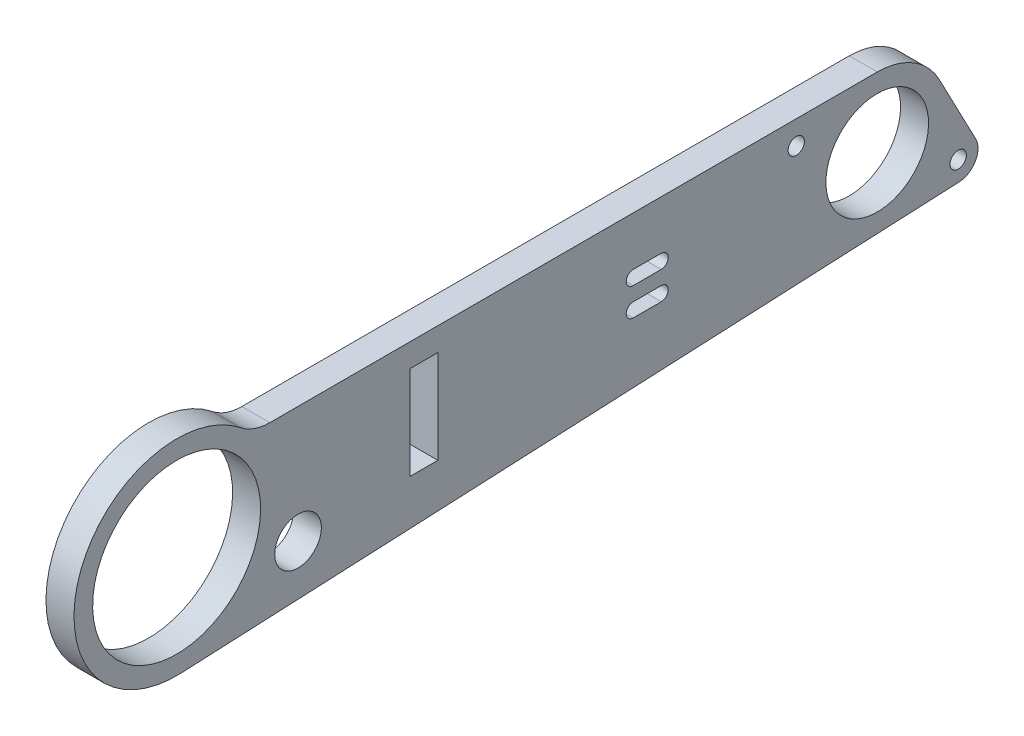
ISO-10303-21;
HEADER;
FILE_DESCRIPTION(('STEP AP214'),'2;1');
FILE_NAME('part.step','',(''),(''),'','','');
FILE_SCHEMA(('AUTOMOTIVE_DESIGN { 1 0 10303 214 1 1 1 1 }'));
ENDSEC;
DATA;
#1=APPLICATION_CONTEXT('core data for automotive mechanical design processes');
#2=APPLICATION_PROTOCOL_DEFINITION('international standard','automotive_design',2000,#1);
#3=PRODUCT_CONTEXT('',#1,'mechanical');
#4=PRODUCT('Part','Part','',(#3));
#5=PRODUCT_RELATED_PRODUCT_CATEGORY('part','',(#4));
#6=PRODUCT_DEFINITION_FORMATION('','',#4);
#7=PRODUCT_DEFINITION_CONTEXT('part definition',#1,'design');
#8=PRODUCT_DEFINITION('design','',#6,#7);
#9=PRODUCT_DEFINITION_SHAPE('','',#8);
#10=(LENGTH_UNIT() NAMED_UNIT(*) SI_UNIT(.MILLI.,.METRE.));
#11=(NAMED_UNIT(*) PLANE_ANGLE_UNIT() SI_UNIT($,.RADIAN.));
#12=(NAMED_UNIT(*) SI_UNIT($,.STERADIAN.) SOLID_ANGLE_UNIT());
#13=UNCERTAINTY_MEASURE_WITH_UNIT(LENGTH_MEASURE(1.E-05),#10,'distance_accuracy_value','');
#14=(GEOMETRIC_REPRESENTATION_CONTEXT(3) GLOBAL_UNCERTAINTY_ASSIGNED_CONTEXT((#13)) GLOBAL_UNIT_ASSIGNED_CONTEXT((#10,
#11,#12)) REPRESENTATION_CONTEXT('',''));
#15=CARTESIAN_POINT('',(0.,0.,0.));
#16=DIRECTION('',(0.,0.,1.));
#17=DIRECTION('',(1.,0.,0.));
#18=AXIS2_PLACEMENT_3D('',#15,#16,#17);
#19=CARTESIAN_POINT('',(-6.,0.,-71.58162225));
#20=DIRECTION('',(1.,0.,0.));
#21=DIRECTION('',(0.,1.,0.));
#22=AXIS2_PLACEMENT_3D('',#19,#20,#21);
#23=PLANE('',#22);
#24=CARTESIAN_POINT('',(-6.,0.,-150.1632445));
#25=DIRECTION('',(1.,0.,0.));
#26=DIRECTION('',(0.,-1.,0.));
#27=AXIS2_PLACEMENT_3D('',#24,#25,#26);
#28=CIRCLE('',#27,11.);
#29=CARTESIAN_POINT('',(-6.,11.,-150.1632445));
#30=VERTEX_POINT('',#29);
#31=EDGE_CURVE('E413',#30,#30,#28,.T.);
#32=ORIENTED_EDGE('',*,*,#31,.T.);
#33=EDGE_LOOP('',(#32));
#34=FACE_BOUND('',#33,.T.);
#35=CARTESIAN_POINT('',(-6.,0.,0.));
#36=DIRECTION('',(1.,0.,0.));
#37=DIRECTION('',(0.,-1.,0.));
#38=AXIS2_PLACEMENT_3D('',#35,#36,#37);
#39=CIRCLE('',#38,18.);
#40=CARTESIAN_POINT('',(-6.,18.,0.));
#41=VERTEX_POINT('',#40);
#42=EDGE_CURVE('E311',#41,#41,#39,.T.);
#43=ORIENTED_EDGE('',*,*,#42,.T.);
#44=EDGE_LOOP('',(#43));
#45=FACE_BOUND('',#44,.T.);
#46=CARTESIAN_POINT('',(-6.,-10.,-26.025550563407));
#47=DIRECTION('',(1.,0.,0.));
#48=DIRECTION('',(0.,0.,-1.));
#49=AXIS2_PLACEMENT_3D('',#46,#47,#48);
#50=CIRCLE('',#49,5.);
#51=CARTESIAN_POINT('',(-6.,-10.,-21.025550563407));
#52=VERTEX_POINT('',#51);
#53=EDGE_CURVE('E264',#52,#52,#50,.T.);
#54=ORIENTED_EDGE('',*,*,#53,.T.);
#55=EDGE_LOOP('',(#54));
#56=FACE_BOUND('',#55,.T.);
#57=CARTESIAN_POINT('',(-6.,-3.,-97.8624835205048));
#58=DIRECTION('',(1.,0.,0.));
#59=DIRECTION('',(0.,1.,0.));
#60=AXIS2_PLACEMENT_3D('',#57,#58,#59);
#61=CIRCLE('',#60,1.5);
#62=CARTESIAN_POINT('',(-6.,-1.5,-97.8624835205048));
#63=VERTEX_POINT('',#62);
#64=CARTESIAN_POINT('',(-6.,-4.5,-97.8624835205048));
#65=VERTEX_POINT('',#64);
#66=EDGE_CURVE('E302',#63,#65,#61,.T.);
#67=ORIENTED_EDGE('',*,*,#66,.T.);
#68=DIRECTION('',(0.,0.,-1.));
#69=VECTOR('',#68,1.);
#70=CARTESIAN_POINT('',(-6.,-4.5,-87.7220528852524));
#71=LINE('',#70,#69);
#72=CARTESIAN_POINT('',(-6.,-4.5,-103.862483520505));
#73=VERTEX_POINT('',#72);
#74=EDGE_CURVE('E437',#65,#73,#71,.T.);
#75=ORIENTED_EDGE('',*,*,#74,.T.);
#76=CARTESIAN_POINT('',(-6.,-3.,-103.862483520505));
#77=DIRECTION('',(1.,0.,0.));
#78=DIRECTION('',(0.,-1.,0.));
#79=AXIS2_PLACEMENT_3D('',#76,#77,#78);
#80=CIRCLE('',#79,1.5);
#81=CARTESIAN_POINT('',(-6.,-1.5,-103.862483520505));
#82=VERTEX_POINT('',#81);
#83=EDGE_CURVE('E346',#73,#82,#80,.T.);
#84=ORIENTED_EDGE('',*,*,#83,.T.);
#85=DIRECTION('',(0.,0.,1.));
#86=VECTOR('',#85,1.);
#87=CARTESIAN_POINT('',(-6.,-1.5,-84.7220528852524));
#88=LINE('',#87,#86);
#89=EDGE_CURVE('E352',#82,#63,#88,.T.);
#90=ORIENTED_EDGE('',*,*,#89,.T.);
#91=EDGE_LOOP('',(#67,#75,#84,#90));
#92=FACE_BOUND('',#91,.T.);
#93=DIRECTION('',(0.,0.,1.));
#94=VECTOR('',#93,1.);
#95=CARTESIAN_POINT('',(-6.,10.,-60.790811125));
#96=LINE('',#95,#94);
#97=CARTESIAN_POINT('',(-6.,10.,-56.));
#98=VERTEX_POINT('',#97);
#99=CARTESIAN_POINT('',(-6.,10.,-50.));
#100=VERTEX_POINT('',#99);
#101=EDGE_CURVE('E321',#98,#100,#96,.T.);
#102=ORIENTED_EDGE('',*,*,#101,.T.);
#103=DIRECTION('',(0.,-1.,0.));
#104=VECTOR('',#103,1.);
#105=CARTESIAN_POINT('',(-6.,-5.,-50.));
#106=LINE('',#105,#104);
#107=CARTESIAN_POINT('',(-6.,-10.,-50.));
#108=VERTEX_POINT('',#107);
#109=EDGE_CURVE('E325',#100,#108,#106,.T.);
#110=ORIENTED_EDGE('',*,*,#109,.T.);
#111=DIRECTION('',(0.,0.,-1.));
#112=VECTOR('',#111,1.);
#113=CARTESIAN_POINT('',(-6.,-10.,-63.790811125));
#114=LINE('',#113,#112);
#115=CARTESIAN_POINT('',(-6.,-10.,-56.));
#116=VERTEX_POINT('',#115);
#117=EDGE_CURVE('E285',#108,#116,#114,.T.);
#118=ORIENTED_EDGE('',*,*,#117,.T.);
#119=DIRECTION('',(0.,1.,0.));
#120=VECTOR('',#119,1.);
#121=CARTESIAN_POINT('',(-6.,5.,-56.));
#122=LINE('',#121,#120);
#123=EDGE_CURVE('E280',#116,#98,#122,.T.);
#124=ORIENTED_EDGE('',*,*,#123,.T.);
#125=EDGE_LOOP('',(#102,#110,#118,#124));
#126=FACE_BOUND('',#125,.T.);
#127=CARTESIAN_POINT('',(-6.,3.,-103.862483520505));
#128=DIRECTION('',(1.,0.,0.));
#129=DIRECTION('',(0.,-1.,0.));
#130=AXIS2_PLACEMENT_3D('',#127,#128,#129);
#131=CIRCLE('',#130,1.5);
#132=CARTESIAN_POINT('',(-6.,1.5,-103.862483520505));
#133=VERTEX_POINT('',#132);
#134=CARTESIAN_POINT('',(-6.,4.5,-103.862483520505));
#135=VERTEX_POINT('',#134);
#136=EDGE_CURVE('E330',#133,#135,#131,.T.);
#137=ORIENTED_EDGE('',*,*,#136,.T.);
#138=DIRECTION('',(0.,0.,1.));
#139=VECTOR('',#138,1.);
#140=CARTESIAN_POINT('',(-6.,4.5,-84.7220528852524));
#141=LINE('',#140,#139);
#142=CARTESIAN_POINT('',(-6.,4.5,-97.8624835205048));
#143=VERTEX_POINT('',#142);
#144=EDGE_CURVE('E172',#135,#143,#141,.T.);
#145=ORIENTED_EDGE('',*,*,#144,.T.);
#146=CARTESIAN_POINT('',(-6.,3.,-97.8624835205048));
#147=DIRECTION('',(1.,0.,0.));
#148=DIRECTION('',(0.,1.,0.));
#149=AXIS2_PLACEMENT_3D('',#146,#147,#148);
#150=CIRCLE('',#149,1.5);
#151=CARTESIAN_POINT('',(-6.,1.5,-97.8624835205048));
#152=VERTEX_POINT('',#151);
#153=EDGE_CURVE('E294',#143,#152,#150,.T.);
#154=ORIENTED_EDGE('',*,*,#153,.T.);
#155=DIRECTION('',(0.,0.,-1.));
#156=VECTOR('',#155,1.);
#157=CARTESIAN_POINT('',(-6.,1.5,-87.7220528852524));
#158=LINE('',#157,#156);
#159=EDGE_CURVE('E373',#152,#133,#158,.T.);
#160=ORIENTED_EDGE('',*,*,#159,.T.);
#161=EDGE_LOOP('',(#137,#145,#154,#160));
#162=FACE_BOUND('',#161,.T.);
#163=CARTESIAN_POINT('',(-6.,-9.95212297192439,-167.511306303893));
#164=DIRECTION('',(1.,0.,0.));
#165=DIRECTION('',(0.,0.,1.));
#166=AXIS2_PLACEMENT_3D('',#163,#164,#165);
#167=CIRCLE('',#166,1.75);
#168=CARTESIAN_POINT('',(-6.,-9.95212297192439,-169.261306303893));
#169=VERTEX_POINT('',#168);
#170=EDGE_CURVE('E363',#169,#169,#167,.T.);
#171=ORIENTED_EDGE('',*,*,#170,.T.);
#172=EDGE_LOOP('',(#171));
#173=FACE_BOUND('',#172,.T.);
#174=CARTESIAN_POINT('',(-6.,9.9521229719244,-132.815182696107));
#175=DIRECTION('',(1.,0.,0.));
#176=DIRECTION('',(0.,0.,-1.));
#177=AXIS2_PLACEMENT_3D('',#174,#175,#176);
#178=CIRCLE('',#177,1.75);
#179=CARTESIAN_POINT('',(-6.,9.9521229719244,-131.065182696107));
#180=VERTEX_POINT('',#179);
#181=EDGE_CURVE('E339',#180,#180,#178,.T.);
#182=ORIENTED_EDGE('',*,*,#181,.T.);
#183=EDGE_LOOP('',(#182));
#184=FACE_BOUND('',#183,.T.);
#185=CARTESIAN_POINT('',(-6.,0.,-150.1632445));
#186=DIRECTION('',(-1.,0.,0.));
#187=DIRECTION('',(0.,1.,0.));
#188=AXIS2_PLACEMENT_3D('',#185,#186,#187);
#189=CIRCLE('',#188,15.);
#190=CARTESIAN_POINT('',(-6.,15.,-150.1632445));
#191=VERTEX_POINT('',#190);
#192=CARTESIAN_POINT('',(-6.,6.95979415000631,-163.450880308884));
#193=VERTEX_POINT('',#192);
#194=EDGE_CURVE('E27',#191,#193,#189,.T.);
#195=ORIENTED_EDGE('',*,*,#194,.T.);
#196=DIRECTION('',(0.,-0.885842387258936,-0.46398627666709));
#197=VECTOR('',#196,1.);
#198=CARTESIAN_POINT('',(-6.,-7.98018129608929,-171.276136449743));
#199=LINE('',#198,#197);
#200=CARTESIAN_POINT('',(-6.,-7.98018129608929,-171.276136449743));
#201=VERTEX_POINT('',#200);
#202=EDGE_CURVE('E295',#193,#201,#199,.T.);
#203=ORIENTED_EDGE('',*,*,#202,.T.);
#204=CARTESIAN_POINT('',(-6.,-9.95212297192439,-167.511306303893));
#205=DIRECTION('',(-1.,0.,0.));
#206=DIRECTION('',(0.,0.,-1.));
#207=AXIS2_PLACEMENT_3D('',#204,#205,#206);
#208=CIRCLE('',#207,4.25);
#209=CARTESIAN_POINT('',(-6.,-14.1975027391585,-167.709424026369));
#210=VERTEX_POINT('',#209);
#211=EDGE_CURVE('E372',#201,#210,#208,.T.);
#212=ORIENTED_EDGE('',*,*,#211,.T.);
#213=DIRECTION('',(0.,-0.046615934700319,0.998912886408027));
#214=VECTOR('',#213,1.);
#215=CARTESIAN_POINT('',(-6.,-14.9836932961204,-150.862483520505));
#216=LINE('',#215,#214);
#217=CARTESIAN_POINT('',(-6.,-21.9760835009766,-1.02555056340702));
#218=VERTEX_POINT('',#217);
#219=EDGE_CURVE('E384',#210,#218,#216,.T.);
#220=ORIENTED_EDGE('',*,*,#219,.T.);
#221=CARTESIAN_POINT('',(-6.,0.,0.));
#222=DIRECTION('',(-1.,0.,0.));
#223=DIRECTION('',(0.,1.,0.));
#224=AXIS2_PLACEMENT_3D('',#221,#222,#223);
#225=CIRCLE('',#224,22.);
#226=CARTESIAN_POINT('',(-6.,17.1875,-13.7328017443637));
#227=VERTEX_POINT('',#226);
#228=EDGE_CURVE('E389',#218,#227,#225,.T.);
#229=ORIENTED_EDGE('',*,*,#228,.T.);
#230=CARTESIAN_POINT('',(-6.,25.,-19.9749843554382));
#231=DIRECTION('',(-1.,0.,0.));
#232=DIRECTION('',(0.,-0.943729304408844,0.330718913883074));
#233=AXIS2_PLACEMENT_3D('',#230,#231,#232);
#234=CIRCLE('',#233,10.);
#235=CARTESIAN_POINT('',(-6.,15.,-19.9749843554382));
#236=VERTEX_POINT('',#235);
#237=EDGE_CURVE('E255',#236,#227,#234,.T.);
#238=ORIENTED_EDGE('',*,*,#237,.F.);
#239=DIRECTION('',(0.,0.,-1.));
#240=VECTOR('',#239,1.);
#241=CARTESIAN_POINT('',(-6.,15.,-150.1632445));
#242=LINE('',#241,#240);
#243=EDGE_CURVE('E443',#236,#191,#242,.T.);
#244=ORIENTED_EDGE('',*,*,#243,.T.);
#245=EDGE_LOOP('',(#195,#203,#212,#220,#229,#238,#244));
#246=FACE_BOUND('',#245,.T.);
#247=ADVANCED_FACE('F16',(#34,#45,#56,#92,#126,#162,#173,#184,#246),#23,.F.);
#248=CARTESIAN_POINT('',(0.,0.,-71.58162225));
#249=DIRECTION('',(1.,0.,0.));
#250=DIRECTION('',(0.,1.,0.));
#251=AXIS2_PLACEMENT_3D('',#248,#249,#250);
#252=PLANE('',#251);
#253=CARTESIAN_POINT('',(0.,0.,-150.1632445));
#254=DIRECTION('',(-1.,0.,0.));
#255=DIRECTION('',(0.,-1.,0.));
#256=AXIS2_PLACEMENT_3D('',#253,#254,#255);
#257=CIRCLE('',#256,11.);
#258=CARTESIAN_POINT('',(0.,11.,-150.1632445));
#259=VERTEX_POINT('',#258);
#260=EDGE_CURVE('E308',#259,#259,#257,.T.);
#261=ORIENTED_EDGE('',*,*,#260,.T.);
#262=EDGE_LOOP('',(#261));
#263=FACE_BOUND('',#262,.T.);
#264=CARTESIAN_POINT('',(0.,0.,0.));
#265=DIRECTION('',(-1.,0.,0.));
#266=DIRECTION('',(0.,-1.,0.));
#267=AXIS2_PLACEMENT_3D('',#264,#265,#266);
#268=CIRCLE('',#267,18.);
#269=CARTESIAN_POINT('',(0.,18.,0.));
#270=VERTEX_POINT('',#269);
#271=EDGE_CURVE('E459',#270,#270,#268,.T.);
#272=ORIENTED_EDGE('',*,*,#271,.T.);
#273=EDGE_LOOP('',(#272));
#274=FACE_BOUND('',#273,.T.);
#275=CARTESIAN_POINT('',(0.,-10.,-26.025550563407));
#276=DIRECTION('',(-1.,0.,0.));
#277=DIRECTION('',(0.,0.,-1.));
#278=AXIS2_PLACEMENT_3D('',#275,#276,#277);
#279=CIRCLE('',#278,5.);
#280=CARTESIAN_POINT('',(0.,-10.,-21.025550563407));
#281=VERTEX_POINT('',#280);
#282=EDGE_CURVE('E364',#281,#281,#279,.T.);
#283=ORIENTED_EDGE('',*,*,#282,.T.);
#284=EDGE_LOOP('',(#283));
#285=FACE_BOUND('',#284,.T.);
#286=CARTESIAN_POINT('',(0.,-3.,-97.8624835205048));
#287=DIRECTION('',(-1.,0.,0.));
#288=DIRECTION('',(0.,1.,0.));
#289=AXIS2_PLACEMENT_3D('',#286,#287,#288);
#290=CIRCLE('',#289,1.5);
#291=CARTESIAN_POINT('',(0.,-4.5,-97.8624835205048));
#292=VERTEX_POINT('',#291);
#293=CARTESIAN_POINT('',(0.,-1.5,-97.8624835205048));
#294=VERTEX_POINT('',#293);
#295=EDGE_CURVE('E299',#292,#294,#290,.T.);
#296=ORIENTED_EDGE('',*,*,#295,.T.);
#297=DIRECTION('',(0.,0.,-1.));
#298=VECTOR('',#297,1.);
#299=CARTESIAN_POINT('',(0.,-1.5,-84.7220528852524));
#300=LINE('',#299,#298);
#301=CARTESIAN_POINT('',(0.,-1.5,-103.862483520505));
#302=VERTEX_POINT('',#301);
#303=EDGE_CURVE('E356',#294,#302,#300,.T.);
#304=ORIENTED_EDGE('',*,*,#303,.T.);
#305=CARTESIAN_POINT('',(0.,-3.,-103.862483520505));
#306=DIRECTION('',(-1.,0.,0.));
#307=DIRECTION('',(0.,-1.,0.));
#308=AXIS2_PLACEMENT_3D('',#305,#306,#307);
#309=CIRCLE('',#308,1.5);
#310=CARTESIAN_POINT('',(0.,-4.5,-103.862483520505));
#311=VERTEX_POINT('',#310);
#312=EDGE_CURVE('E345',#302,#311,#309,.T.);
#313=ORIENTED_EDGE('',*,*,#312,.T.);
#314=DIRECTION('',(0.,0.,1.));
#315=VECTOR('',#314,1.);
#316=CARTESIAN_POINT('',(0.,-4.5,-87.7220528852524));
#317=LINE('',#316,#315);
#318=EDGE_CURVE('E368',#311,#292,#317,.T.);
#319=ORIENTED_EDGE('',*,*,#318,.T.);
#320=EDGE_LOOP('',(#296,#304,#313,#319));
#321=FACE_BOUND('',#320,.T.);
#322=DIRECTION('',(0.,0.,-1.));
#323=VECTOR('',#322,1.);
#324=CARTESIAN_POINT('',(0.,10.,-60.790811125));
#325=LINE('',#324,#323);
#326=CARTESIAN_POINT('',(0.,10.,-50.));
#327=VERTEX_POINT('',#326);
#328=CARTESIAN_POINT('',(0.,10.,-56.));
#329=VERTEX_POINT('',#328);
#330=EDGE_CURVE('E317',#327,#329,#325,.T.);
#331=ORIENTED_EDGE('',*,*,#330,.T.);
#332=DIRECTION('',(0.,-1.,0.));
#333=VECTOR('',#332,1.);
#334=CARTESIAN_POINT('',(0.,5.,-56.));
#335=LINE('',#334,#333);
#336=CARTESIAN_POINT('',(0.,-10.,-56.));
#337=VERTEX_POINT('',#336);
#338=EDGE_CURVE('E20',#329,#337,#335,.T.);
#339=ORIENTED_EDGE('',*,*,#338,.T.);
#340=DIRECTION('',(0.,0.,1.));
#341=VECTOR('',#340,1.);
#342=CARTESIAN_POINT('',(0.,-10.,-63.790811125));
#343=LINE('',#342,#341);
#344=CARTESIAN_POINT('',(0.,-10.,-50.));
#345=VERTEX_POINT('',#344);
#346=EDGE_CURVE('E392',#337,#345,#343,.T.);
#347=ORIENTED_EDGE('',*,*,#346,.T.);
#348=DIRECTION('',(0.,1.,0.));
#349=VECTOR('',#348,1.);
#350=CARTESIAN_POINT('',(0.,-5.,-50.));
#351=LINE('',#350,#349);
#352=EDGE_CURVE('E431',#345,#327,#351,.T.);
#353=ORIENTED_EDGE('',*,*,#352,.T.);
#354=EDGE_LOOP('',(#331,#339,#347,#353));
#355=FACE_BOUND('',#354,.T.);
#356=CARTESIAN_POINT('',(0.,3.,-103.862483520505));
#357=DIRECTION('',(-1.,0.,0.));
#358=DIRECTION('',(0.,-1.,0.));
#359=AXIS2_PLACEMENT_3D('',#356,#357,#358);
#360=CIRCLE('',#359,1.5);
#361=CARTESIAN_POINT('',(0.,4.5,-103.862483520505));
#362=VERTEX_POINT('',#361);
#363=CARTESIAN_POINT('',(0.,1.5,-103.862483520505));
#364=VERTEX_POINT('',#363);
#365=EDGE_CURVE('E298',#362,#364,#360,.T.);
#366=ORIENTED_EDGE('',*,*,#365,.T.);
#367=DIRECTION('',(0.,0.,1.));
#368=VECTOR('',#367,1.);
#369=CARTESIAN_POINT('',(0.,1.5,-87.7220528852524));
#370=LINE('',#369,#368);
#371=CARTESIAN_POINT('',(0.,1.5,-97.8624835205048));
#372=VERTEX_POINT('',#371);
#373=EDGE_CURVE('E276',#364,#372,#370,.T.);
#374=ORIENTED_EDGE('',*,*,#373,.T.);
#375=CARTESIAN_POINT('',(0.,3.,-97.8624835205048));
#376=DIRECTION('',(-1.,0.,0.));
#377=DIRECTION('',(0.,1.,0.));
#378=AXIS2_PLACEMENT_3D('',#375,#376,#377);
#379=CIRCLE('',#378,1.5);
#380=CARTESIAN_POINT('',(0.,4.5,-97.8624835205048));
#381=VERTEX_POINT('',#380);
#382=EDGE_CURVE('E313',#372,#381,#379,.T.);
#383=ORIENTED_EDGE('',*,*,#382,.T.);
#384=DIRECTION('',(0.,0.,-1.));
#385=VECTOR('',#384,1.);
#386=CARTESIAN_POINT('',(0.,4.5,-84.7220528852524));
#387=LINE('',#386,#385);
#388=EDGE_CURVE('E157',#381,#362,#387,.T.);
#389=ORIENTED_EDGE('',*,*,#388,.T.);
#390=EDGE_LOOP('',(#366,#374,#383,#389));
#391=FACE_BOUND('',#390,.T.);
#392=CARTESIAN_POINT('',(0.,-9.95212297192439,-167.511306303893));
#393=DIRECTION('',(-1.,0.,0.));
#394=DIRECTION('',(0.,0.,1.));
#395=AXIS2_PLACEMENT_3D('',#392,#393,#394);
#396=CIRCLE('',#395,1.75);
#397=CARTESIAN_POINT('',(0.,-9.95212297192439,-169.261306303893));
#398=VERTEX_POINT('',#397);
#399=EDGE_CURVE('E198',#398,#398,#396,.T.);
#400=ORIENTED_EDGE('',*,*,#399,.T.);
#401=EDGE_LOOP('',(#400));
#402=FACE_BOUND('',#401,.T.);
#403=CARTESIAN_POINT('',(0.,9.9521229719244,-132.815182696107));
#404=DIRECTION('',(-1.,0.,0.));
#405=DIRECTION('',(0.,0.,-1.));
#406=AXIS2_PLACEMENT_3D('',#403,#404,#405);
#407=CIRCLE('',#406,1.75);
#408=CARTESIAN_POINT('',(0.,9.9521229719244,-131.065182696107));
#409=VERTEX_POINT('',#408);
#410=EDGE_CURVE('E340',#409,#409,#407,.T.);
#411=ORIENTED_EDGE('',*,*,#410,.T.);
#412=EDGE_LOOP('',(#411));
#413=FACE_BOUND('',#412,.T.);
#414=CARTESIAN_POINT('',(0.,0.,-150.1632445));
#415=DIRECTION('',(1.,0.,0.));
#416=DIRECTION('',(0.,1.,0.));
#417=AXIS2_PLACEMENT_3D('',#414,#415,#416);
#418=CIRCLE('',#417,15.);
#419=CARTESIAN_POINT('',(0.,6.95979415000631,-163.450880308884));
#420=VERTEX_POINT('',#419);
#421=CARTESIAN_POINT('',(0.,15.,-150.1632445));
#422=VERTEX_POINT('',#421);
#423=EDGE_CURVE('E10',#420,#422,#418,.T.);
#424=ORIENTED_EDGE('',*,*,#423,.T.);
#425=DIRECTION('',(0.,0.,1.));
#426=VECTOR('',#425,1.);
#427=CARTESIAN_POINT('',(0.,15.,-150.1632445));
#428=LINE('',#427,#426);
#429=CARTESIAN_POINT('',(0.,15.,-19.9749843554382));
#430=VERTEX_POINT('',#429);
#431=EDGE_CURVE('E257',#422,#430,#428,.T.);
#432=ORIENTED_EDGE('',*,*,#431,.T.);
#433=CARTESIAN_POINT('',(0.,25.,-19.9749843554382));
#434=DIRECTION('',(1.,0.,0.));
#435=DIRECTION('',(0.,-0.943729304408844,0.330718913883074));
#436=AXIS2_PLACEMENT_3D('',#433,#434,#435);
#437=CIRCLE('',#436,10.);
#438=CARTESIAN_POINT('',(0.,17.1875,-13.7328017443637));
#439=VERTEX_POINT('',#438);
#440=EDGE_CURVE('E253',#439,#430,#437,.T.);
#441=ORIENTED_EDGE('',*,*,#440,.F.);
#442=CARTESIAN_POINT('',(0.,0.,0.));
#443=DIRECTION('',(1.,0.,0.));
#444=DIRECTION('',(0.,1.,0.));
#445=AXIS2_PLACEMENT_3D('',#442,#443,#444);
#446=CIRCLE('',#445,22.);
#447=CARTESIAN_POINT('',(0.,-21.9760835009766,-1.02555056340701));
#448=VERTEX_POINT('',#447);
#449=EDGE_CURVE('E239',#439,#448,#446,.T.);
#450=ORIENTED_EDGE('',*,*,#449,.T.);
#451=DIRECTION('',(0.,0.046615934700319,-0.998912886408027));
#452=VECTOR('',#451,1.);
#453=CARTESIAN_POINT('',(0.,-14.9836932961204,-150.862483520505));
#454=LINE('',#453,#452);
#455=CARTESIAN_POINT('',(0.,-14.1975027391585,-167.709424026369));
#456=VERTEX_POINT('',#455);
#457=EDGE_CURVE('E41',#448,#456,#454,.T.);
#458=ORIENTED_EDGE('',*,*,#457,.T.);
#459=CARTESIAN_POINT('',(0.,-9.95212297192439,-167.511306303893));
#460=DIRECTION('',(1.,0.,0.));
#461=DIRECTION('',(0.,0.,-1.));
#462=AXIS2_PLACEMENT_3D('',#459,#460,#461);
#463=CIRCLE('',#462,4.25);
#464=CARTESIAN_POINT('',(0.,-7.98018129608929,-171.276136449743));
#465=VERTEX_POINT('',#464);
#466=EDGE_CURVE('E326',#456,#465,#463,.T.);
#467=ORIENTED_EDGE('',*,*,#466,.T.);
#468=DIRECTION('',(0.,0.885842387258936,0.46398627666709));
#469=VECTOR('',#468,1.);
#470=CARTESIAN_POINT('',(0.,-7.98018129608929,-171.276136449743));
#471=LINE('',#470,#469);
#472=EDGE_CURVE('E347',#465,#420,#471,.T.);
#473=ORIENTED_EDGE('',*,*,#472,.T.);
#474=EDGE_LOOP('',(#424,#432,#441,#450,#458,#467,#473));
#475=FACE_BOUND('',#474,.T.);
#476=ADVANCED_FACE('F259',(#263,#274,#285,#321,#355,#391,#402,#413,#475),#252,.T.);
#477=CARTESIAN_POINT('',(0.,0.,-150.1632445));
#478=DIRECTION('',(-1.,0.,0.));
#479=DIRECTION('',(0.,1.,0.));
#480=AXIS2_PLACEMENT_3D('',#477,#478,#479);
#481=CYLINDRICAL_SURFACE('',#480,15.);
#482=DIRECTION('',(-1.,0.,0.));
#483=VECTOR('',#482,1.);
#484=CARTESIAN_POINT('',(0.,6.95979415000632,-163.450880308884));
#485=LINE('',#484,#483);
#486=EDGE_CURVE('E290',#420,#193,#485,.T.);
#487=ORIENTED_EDGE('',*,*,#486,.T.);
#488=ORIENTED_EDGE('',*,*,#194,.F.);
#489=DIRECTION('',(-1.,0.,0.));
#490=VECTOR('',#489,1.);
#491=CARTESIAN_POINT('',(0.,15.,-150.1632445));
#492=LINE('',#491,#490);
#493=EDGE_CURVE('E418',#422,#191,#492,.T.);
#494=ORIENTED_EDGE('',*,*,#493,.F.);
#495=ORIENTED_EDGE('',*,*,#423,.F.);
#496=EDGE_LOOP('',(#487,#488,#494,#495));
#497=FACE_BOUND('',#496,.T.);
#498=ADVANCED_FACE('F529',(#497),#481,.T.);
#499=CARTESIAN_POINT('',(0.,-14.9836932961204,-150.862483520505));
#500=DIRECTION('',(0.,-0.998912886408027,-0.0466159347003187));
#501=DIRECTION('',(0.,0.0466159347003187,-0.998912886408027));
#502=AXIS2_PLACEMENT_3D('',#499,#500,#501);
#503=PLANE('',#502);
#504=ORIENTED_EDGE('',*,*,#457,.F.);
#505=DIRECTION('',(-1.,0.,0.));
#506=VECTOR('',#505,1.);
#507=CARTESIAN_POINT('',(0.,-21.9760835009766,-1.02555056340701));
#508=LINE('',#507,#506);
#509=EDGE_CURVE('E245',#448,#218,#508,.T.);
#510=ORIENTED_EDGE('',*,*,#509,.T.);
#511=ORIENTED_EDGE('',*,*,#219,.F.);
#512=DIRECTION('',(-1.,0.,0.));
#513=VECTOR('',#512,1.);
#514=CARTESIAN_POINT('',(0.,-14.1975027391585,-167.709424026369));
#515=LINE('',#514,#513);
#516=EDGE_CURVE('E329',#456,#210,#515,.T.);
#517=ORIENTED_EDGE('',*,*,#516,.F.);
#518=EDGE_LOOP('',(#504,#510,#511,#517));
#519=FACE_BOUND('',#518,.T.);
#520=ADVANCED_FACE('F538',(#519),#503,.T.);
#521=CARTESIAN_POINT('',(0.,0.,0.));
#522=DIRECTION('',(-1.,0.,0.));
#523=DIRECTION('',(0.,0.308626627006808,0.951183265781311));
#524=AXIS2_PLACEMENT_3D('',#521,#522,#523);
#525=CYLINDRICAL_SURFACE('',#524,22.);
#526=DIRECTION('',(1.,0.,0.));
#527=VECTOR('',#526,1.);
#528=CARTESIAN_POINT('',(0.,17.1875,-13.7328017443637));
#529=LINE('',#528,#527);
#530=EDGE_CURVE('E243',#227,#439,#529,.T.);
#531=ORIENTED_EDGE('',*,*,#530,.F.);
#532=ORIENTED_EDGE('',*,*,#228,.F.);
#533=ORIENTED_EDGE('',*,*,#509,.F.);
#534=ORIENTED_EDGE('',*,*,#449,.F.);
#535=EDGE_LOOP('',(#531,#532,#533,#534));
#536=FACE_BOUND('',#535,.T.);
#537=ADVANCED_FACE('F241',(#536),#525,.T.);
#538=CARTESIAN_POINT('',(0.,0.,0.));
#539=DIRECTION('',(-1.,0.,0.));
#540=DIRECTION('',(0.,-1.,0.));
#541=AXIS2_PLACEMENT_3D('',#538,#539,#540);
#542=CYLINDRICAL_SURFACE('',#541,18.);
#543=ORIENTED_EDGE('',*,*,#42,.F.);
#544=DIRECTION('',(1.,0.,0.));
#545=VECTOR('',#544,1.);
#546=CARTESIAN_POINT('',(0.,18.,0.));
#547=LINE('',#546,#545);
#548=EDGE_CURVE('E455',#41,#270,#547,.T.);
#549=ORIENTED_EDGE('',*,*,#548,.T.);
#550=ORIENTED_EDGE('',*,*,#271,.F.);
#551=ORIENTED_EDGE('',*,*,#548,.F.);
#552=EDGE_LOOP('',(#543,#549,#550,#551));
#553=FACE_BOUND('',#552,.T.);
#554=ADVANCED_FACE('F546',(#553),#542,.F.);
#555=CARTESIAN_POINT('',(0.,0.,-150.1632445));
#556=DIRECTION('',(-1.,0.,0.));
#557=DIRECTION('',(0.,-1.,0.));
#558=AXIS2_PLACEMENT_3D('',#555,#556,#557);
#559=CYLINDRICAL_SURFACE('',#558,11.);
#560=ORIENTED_EDGE('',*,*,#31,.F.);
#561=DIRECTION('',(1.,0.,0.));
#562=VECTOR('',#561,1.);
#563=CARTESIAN_POINT('',(0.,11.,-150.1632445));
#564=LINE('',#563,#562);
#565=EDGE_CURVE('E312',#30,#259,#564,.T.);
#566=ORIENTED_EDGE('',*,*,#565,.T.);
#567=ORIENTED_EDGE('',*,*,#260,.F.);
#568=ORIENTED_EDGE('',*,*,#565,.F.);
#569=EDGE_LOOP('',(#560,#566,#567,#568));
#570=FACE_BOUND('',#569,.T.);
#571=ADVANCED_FACE('F561',(#570),#559,.F.);
#572=CARTESIAN_POINT('',(0.,15.,-16.0934769394311));
#573=DIRECTION('',(0.,1.,0.));
#574=DIRECTION('',(1.,0.,0.));
#575=AXIS2_PLACEMENT_3D('',#572,#573,#574);
#576=PLANE('',#575);
#577=DIRECTION('',(-1.,0.,0.));
#578=VECTOR('',#577,1.);
#579=CARTESIAN_POINT('',(0.,15.,-19.9749843554382));
#580=LINE('',#579,#578);
#581=EDGE_CURVE('E263',#430,#236,#580,.T.);
#582=ORIENTED_EDGE('',*,*,#581,.F.);
#583=ORIENTED_EDGE('',*,*,#431,.F.);
#584=ORIENTED_EDGE('',*,*,#493,.T.);
#585=ORIENTED_EDGE('',*,*,#243,.F.);
#586=EDGE_LOOP('',(#582,#583,#584,#585));
#587=FACE_BOUND('',#586,.T.);
#588=ADVANCED_FACE('F18',(#587),#576,.T.);
#589=CARTESIAN_POINT('',(0.,25.,-19.9749843554382));
#590=DIRECTION('',(-1.,0.,0.));
#591=DIRECTION('',(0.,-0.943729304408844,0.330718913883074));
#592=AXIS2_PLACEMENT_3D('',#589,#590,#591);
#593=CYLINDRICAL_SURFACE('',#592,10.);
#594=ORIENTED_EDGE('',*,*,#440,.T.);
#595=ORIENTED_EDGE('',*,*,#581,.T.);
#596=ORIENTED_EDGE('',*,*,#237,.T.);
#597=ORIENTED_EDGE('',*,*,#530,.T.);
#598=EDGE_LOOP('',(#594,#595,#596,#597));
#599=FACE_BOUND('',#598,.T.);
#600=ADVANCED_FACE('F251',(#599),#593,.F.);
#601=CARTESIAN_POINT('',(0.,-10.,-26.025550563407));
#602=DIRECTION('',(-1.,0.,0.));
#603=DIRECTION('',(0.,0.,-1.));
#604=AXIS2_PLACEMENT_3D('',#601,#602,#603);
#605=CYLINDRICAL_SURFACE('',#604,5.);
#606=ORIENTED_EDGE('',*,*,#282,.F.);
#607=DIRECTION('',(-1.,0.,0.));
#608=VECTOR('',#607,1.);
#609=CARTESIAN_POINT('',(0.,-10.,-21.025550563407));
#610=LINE('',#609,#608);
#611=EDGE_CURVE('E272',#281,#52,#610,.T.);
#612=ORIENTED_EDGE('',*,*,#611,.T.);
#613=ORIENTED_EDGE('',*,*,#53,.F.);
#614=ORIENTED_EDGE('',*,*,#611,.F.);
#615=EDGE_LOOP('',(#606,#612,#613,#614));
#616=FACE_BOUND('',#615,.T.);
#617=ADVANCED_FACE('F743',(#616),#605,.F.);
#618=CARTESIAN_POINT('',(0.,-4.5,-103.862483520505));
#619=DIRECTION('',(0.,-1.,0.));
#620=DIRECTION('',(0.,0.,-1.));
#621=AXIS2_PLACEMENT_3D('',#618,#619,#620);
#622=PLANE('',#621);
#623=ORIENTED_EDGE('',*,*,#74,.F.);
#624=DIRECTION('',(-1.,0.,0.));
#625=VECTOR('',#624,1.);
#626=CARTESIAN_POINT('',(0.,-4.5,-97.8624835205048));
#627=LINE('',#626,#625);
#628=EDGE_CURVE('E301',#292,#65,#627,.T.);
#629=ORIENTED_EDGE('',*,*,#628,.F.);
#630=ORIENTED_EDGE('',*,*,#318,.F.);
#631=DIRECTION('',(-1.,0.,0.));
#632=VECTOR('',#631,1.);
#633=CARTESIAN_POINT('',(0.,-4.5,-103.862483520505));
#634=LINE('',#633,#632);
#635=EDGE_CURVE('E341',#311,#73,#634,.T.);
#636=ORIENTED_EDGE('',*,*,#635,.T.);
#637=EDGE_LOOP('',(#623,#629,#630,#636));
#638=FACE_BOUND('',#637,.T.);
#639=ADVANCED_FACE('F754',(#638),#622,.F.);
#640=CARTESIAN_POINT('',(0.,-3.,-97.8624835205048));
#641=DIRECTION('',(-1.,0.,0.));
#642=DIRECTION('',(0.,1.,0.));
#643=AXIS2_PLACEMENT_3D('',#640,#641,#642);
#644=CYLINDRICAL_SURFACE('',#643,1.5);
#645=ORIENTED_EDGE('',*,*,#66,.F.);
#646=DIRECTION('',(-1.,0.,0.));
#647=VECTOR('',#646,1.);
#648=CARTESIAN_POINT('',(0.,-1.5,-97.8624835205048));
#649=LINE('',#648,#647);
#650=EDGE_CURVE('E377',#294,#63,#649,.T.);
#651=ORIENTED_EDGE('',*,*,#650,.F.);
#652=ORIENTED_EDGE('',*,*,#295,.F.);
#653=ORIENTED_EDGE('',*,*,#628,.T.);
#654=EDGE_LOOP('',(#645,#651,#652,#653));
#655=FACE_BOUND('',#654,.T.);
#656=ADVANCED_FACE('F498',(#655),#644,.F.);
#657=CARTESIAN_POINT('',(0.,-1.5,-97.8624835205048));
#658=DIRECTION('',(0.,1.,0.));
#659=DIRECTION('',(0.,0.,-1.));
#660=AXIS2_PLACEMENT_3D('',#657,#658,#659);
#661=PLANE('',#660);
#662=ORIENTED_EDGE('',*,*,#89,.F.);
#663=DIRECTION('',(-1.,0.,0.));
#664=VECTOR('',#663,1.);
#665=CARTESIAN_POINT('',(0.,-1.5,-103.862483520505));
#666=LINE('',#665,#664);
#667=EDGE_CURVE('E357',#302,#82,#666,.T.);
#668=ORIENTED_EDGE('',*,*,#667,.F.);
#669=ORIENTED_EDGE('',*,*,#303,.F.);
#670=ORIENTED_EDGE('',*,*,#650,.T.);
#671=EDGE_LOOP('',(#662,#668,#669,#670));
#672=FACE_BOUND('',#671,.T.);
#673=ADVANCED_FACE('F506',(#672),#661,.F.);
#674=CARTESIAN_POINT('',(0.,-3.,-103.862483520505));
#675=DIRECTION('',(-1.,0.,0.));
#676=DIRECTION('',(0.,-1.,0.));
#677=AXIS2_PLACEMENT_3D('',#674,#675,#676);
#678=CYLINDRICAL_SURFACE('',#677,1.5);
#679=ORIENTED_EDGE('',*,*,#83,.F.);
#680=ORIENTED_EDGE('',*,*,#635,.F.);
#681=ORIENTED_EDGE('',*,*,#312,.F.);
#682=ORIENTED_EDGE('',*,*,#667,.T.);
#683=EDGE_LOOP('',(#679,#680,#681,#682));
#684=FACE_BOUND('',#683,.T.);
#685=ADVANCED_FACE('F510',(#684),#678,.F.);
#686=CARTESIAN_POINT('',(0.,-10.,-50.));
#687=DIRECTION('',(0.,0.,1.));
#688=DIRECTION('',(1.,0.,0.));
#689=AXIS2_PLACEMENT_3D('',#686,#687,#688);
#690=PLANE('',#689);
#691=ORIENTED_EDGE('',*,*,#109,.F.);
#692=DIRECTION('',(-1.,0.,0.));
#693=VECTOR('',#692,1.);
#694=CARTESIAN_POINT('',(0.,10.,-50.));
#695=LINE('',#694,#693);
#696=EDGE_CURVE('E320',#327,#100,#695,.T.);
#697=ORIENTED_EDGE('',*,*,#696,.F.);
#698=ORIENTED_EDGE('',*,*,#352,.F.);
#699=DIRECTION('',(-1.,0.,0.));
#700=VECTOR('',#699,1.);
#701=CARTESIAN_POINT('',(0.,-10.,-50.));
#702=LINE('',#701,#700);
#703=EDGE_CURVE('E289',#345,#108,#702,.T.);
#704=ORIENTED_EDGE('',*,*,#703,.T.);
#705=EDGE_LOOP('',(#691,#697,#698,#704));
#706=FACE_BOUND('',#705,.T.);
#707=ADVANCED_FACE('F475',(#706),#690,.F.);
#708=CARTESIAN_POINT('',(0.,10.,-50.));
#709=DIRECTION('',(0.,1.,0.));
#710=DIRECTION('',(0.,0.,-1.));
#711=AXIS2_PLACEMENT_3D('',#708,#709,#710);
#712=PLANE('',#711);
#713=ORIENTED_EDGE('',*,*,#101,.F.);
#714=DIRECTION('',(-1.,0.,0.));
#715=VECTOR('',#714,1.);
#716=CARTESIAN_POINT('',(0.,10.,-56.));
#717=LINE('',#716,#715);
#718=EDGE_CURVE('E407',#329,#98,#717,.T.);
#719=ORIENTED_EDGE('',*,*,#718,.F.);
#720=ORIENTED_EDGE('',*,*,#330,.F.);
#721=ORIENTED_EDGE('',*,*,#696,.T.);
#722=EDGE_LOOP('',(#713,#719,#720,#721));
#723=FACE_BOUND('',#722,.T.);
#724=ADVANCED_FACE('F615',(#723),#712,.F.);
#725=CARTESIAN_POINT('',(0.,10.,-56.));
#726=DIRECTION('',(0.,0.,-1.));
#727=DIRECTION('',(0.,-1.,0.));
#728=AXIS2_PLACEMENT_3D('',#725,#726,#727);
#729=PLANE('',#728);
#730=ORIENTED_EDGE('',*,*,#123,.F.);
#731=DIRECTION('',(-1.,0.,0.));
#732=VECTOR('',#731,1.);
#733=CARTESIAN_POINT('',(0.,-10.,-56.));
#734=LINE('',#733,#732);
#735=EDGE_CURVE('E284',#337,#116,#734,.T.);
#736=ORIENTED_EDGE('',*,*,#735,.F.);
#737=ORIENTED_EDGE('',*,*,#338,.F.);
#738=ORIENTED_EDGE('',*,*,#718,.T.);
#739=EDGE_LOOP('',(#730,#736,#737,#738));
#740=FACE_BOUND('',#739,.T.);
#741=ADVANCED_FACE('F610',(#740),#729,.F.);
#742=CARTESIAN_POINT('',(0.,-10.,-56.));
#743=DIRECTION('',(0.,-1.,0.));
#744=DIRECTION('',(0.,0.,-1.));
#745=AXIS2_PLACEMENT_3D('',#742,#743,#744);
#746=PLANE('',#745);
#747=ORIENTED_EDGE('',*,*,#117,.F.);
#748=ORIENTED_EDGE('',*,*,#703,.F.);
#749=ORIENTED_EDGE('',*,*,#346,.F.);
#750=ORIENTED_EDGE('',*,*,#735,.T.);
#751=EDGE_LOOP('',(#747,#748,#749,#750));
#752=FACE_BOUND('',#751,.T.);
#753=ADVANCED_FACE('F479',(#752),#746,.F.);
#754=CARTESIAN_POINT('',(0.,4.5,-97.8624835205048));
#755=DIRECTION('',(0.,1.,0.));
#756=DIRECTION('',(0.,0.,-1.));
#757=AXIS2_PLACEMENT_3D('',#754,#755,#756);
#758=PLANE('',#757);
#759=ORIENTED_EDGE('',*,*,#144,.F.);
#760=DIRECTION('',(-1.,0.,0.));
#761=VECTOR('',#760,1.);
#762=CARTESIAN_POINT('',(0.,4.5,-103.862483520505));
#763=LINE('',#762,#761);
#764=EDGE_CURVE('E279',#362,#135,#763,.T.);
#765=ORIENTED_EDGE('',*,*,#764,.F.);
#766=ORIENTED_EDGE('',*,*,#388,.F.);
#767=DIRECTION('',(-1.,0.,0.));
#768=VECTOR('',#767,1.);
#769=CARTESIAN_POINT('',(0.,4.5,-97.8624835205048));
#770=LINE('',#769,#768);
#771=EDGE_CURVE('E307',#381,#143,#770,.T.);
#772=ORIENTED_EDGE('',*,*,#771,.T.);
#773=EDGE_LOOP('',(#759,#765,#766,#772));
#774=FACE_BOUND('',#773,.T.);
#775=ADVANCED_FACE('F609',(#774),#758,.F.);
#776=CARTESIAN_POINT('',(0.,3.,-103.862483520505));
#777=DIRECTION('',(-1.,0.,0.));
#778=DIRECTION('',(0.,-1.,0.));
#779=AXIS2_PLACEMENT_3D('',#776,#777,#778);
#780=CYLINDRICAL_SURFACE('',#779,1.5);
#781=ORIENTED_EDGE('',*,*,#136,.F.);
#782=DIRECTION('',(-1.,0.,0.));
#783=VECTOR('',#782,1.);
#784=CARTESIAN_POINT('',(0.,1.5,-103.862483520505));
#785=LINE('',#784,#783);
#786=EDGE_CURVE('E334',#364,#133,#785,.T.);
#787=ORIENTED_EDGE('',*,*,#786,.F.);
#788=ORIENTED_EDGE('',*,*,#365,.F.);
#789=ORIENTED_EDGE('',*,*,#764,.T.);
#790=EDGE_LOOP('',(#781,#787,#788,#789));
#791=FACE_BOUND('',#790,.T.);
#792=ADVANCED_FACE('F601',(#791),#780,.F.);
#793=CARTESIAN_POINT('',(0.,1.5,-103.862483520505));
#794=DIRECTION('',(0.,-1.,0.));
#795=DIRECTION('',(0.,0.,-1.));
#796=AXIS2_PLACEMENT_3D('',#793,#794,#795);
#797=PLANE('',#796);
#798=ORIENTED_EDGE('',*,*,#159,.F.);
#799=DIRECTION('',(-1.,0.,0.));
#800=VECTOR('',#799,1.);
#801=CARTESIAN_POINT('',(0.,1.5,-97.8624835205048));
#802=LINE('',#801,#800);
#803=EDGE_CURVE('E316',#372,#152,#802,.T.);
#804=ORIENTED_EDGE('',*,*,#803,.F.);
#805=ORIENTED_EDGE('',*,*,#373,.F.);
#806=ORIENTED_EDGE('',*,*,#786,.T.);
#807=EDGE_LOOP('',(#798,#804,#805,#806));
#808=FACE_BOUND('',#807,.T.);
#809=ADVANCED_FACE('F597',(#808),#797,.F.);
#810=CARTESIAN_POINT('',(0.,3.,-97.8624835205048));
#811=DIRECTION('',(-1.,0.,0.));
#812=DIRECTION('',(0.,1.,0.));
#813=AXIS2_PLACEMENT_3D('',#810,#811,#812);
#814=CYLINDRICAL_SURFACE('',#813,1.5);
#815=ORIENTED_EDGE('',*,*,#153,.F.);
#816=ORIENTED_EDGE('',*,*,#771,.F.);
#817=ORIENTED_EDGE('',*,*,#382,.F.);
#818=ORIENTED_EDGE('',*,*,#803,.T.);
#819=EDGE_LOOP('',(#815,#816,#817,#818));
#820=FACE_BOUND('',#819,.T.);
#821=ADVANCED_FACE('F600',(#820),#814,.F.);
#822=CARTESIAN_POINT('',(0.,6.95979415000631,-163.450880308884));
#823=DIRECTION('',(0.,0.46398627666709,-0.885842387258936));
#824=DIRECTION('',(-1.,0.,0.));
#825=AXIS2_PLACEMENT_3D('',#822,#823,#824);
#826=PLANE('',#825);
#827=ORIENTED_EDGE('',*,*,#472,.F.);
#828=DIRECTION('',(-1.,0.,0.));
#829=VECTOR('',#828,1.);
#830=CARTESIAN_POINT('',(0.,-7.98018129608929,-171.276136449743));
#831=LINE('',#830,#829);
#832=EDGE_CURVE('E351',#465,#201,#831,.T.);
#833=ORIENTED_EDGE('',*,*,#832,.T.);
#834=ORIENTED_EDGE('',*,*,#202,.F.);
#835=ORIENTED_EDGE('',*,*,#486,.F.);
#836=EDGE_LOOP('',(#827,#833,#834,#835));
#837=FACE_BOUND('',#836,.T.);
#838=ADVANCED_FACE('F605',(#837),#826,.T.);
#839=CARTESIAN_POINT('',(0.,-9.95212297192439,-167.511306303893));
#840=DIRECTION('',(-1.,0.,0.));
#841=DIRECTION('',(0.,0.,-1.));
#842=AXIS2_PLACEMENT_3D('',#839,#840,#841);
#843=CYLINDRICAL_SURFACE('',#842,4.25);
#844=ORIENTED_EDGE('',*,*,#466,.F.);
#845=ORIENTED_EDGE('',*,*,#516,.T.);
#846=ORIENTED_EDGE('',*,*,#211,.F.);
#847=ORIENTED_EDGE('',*,*,#832,.F.);
#848=EDGE_LOOP('',(#844,#845,#846,#847));
#849=FACE_BOUND('',#848,.T.);
#850=ADVANCED_FACE('F594',(#849),#843,.T.);
#851=CARTESIAN_POINT('',(0.,-9.95212297192439,-167.511306303893));
#852=DIRECTION('',(-1.,0.,0.));
#853=DIRECTION('',(0.,0.,1.));
#854=AXIS2_PLACEMENT_3D('',#851,#852,#853);
#855=CYLINDRICAL_SURFACE('',#854,1.75);
#856=ORIENTED_EDGE('',*,*,#170,.F.);
#857=DIRECTION('',(1.,0.,0.));
#858=VECTOR('',#857,1.);
#859=CARTESIAN_POINT('',(0.,-9.95212297192439,-169.261306303893));
#860=LINE('',#859,#858);
#861=EDGE_CURVE('E394',#169,#398,#860,.T.);
#862=ORIENTED_EDGE('',*,*,#861,.T.);
#863=ORIENTED_EDGE('',*,*,#399,.F.);
#864=ORIENTED_EDGE('',*,*,#861,.F.);
#865=EDGE_LOOP('',(#856,#862,#863,#864));
#866=FACE_BOUND('',#865,.T.);
#867=ADVANCED_FACE('F590',(#866),#855,.F.);
#868=CARTESIAN_POINT('',(0.,9.9521229719244,-132.815182696107));
#869=DIRECTION('',(-1.,0.,0.));
#870=DIRECTION('',(0.,0.,-1.));
#871=AXIS2_PLACEMENT_3D('',#868,#869,#870);
#872=CYLINDRICAL_SURFACE('',#871,1.75);
#873=ORIENTED_EDGE('',*,*,#410,.F.);
#874=DIRECTION('',(-1.,0.,0.));
#875=VECTOR('',#874,1.);
#876=CARTESIAN_POINT('',(0.,9.9521229719244,-131.065182696107));
#877=LINE('',#876,#875);
#878=EDGE_CURVE('E335',#409,#180,#877,.T.);
#879=ORIENTED_EDGE('',*,*,#878,.T.);
#880=ORIENTED_EDGE('',*,*,#181,.F.);
#881=ORIENTED_EDGE('',*,*,#878,.F.);
#882=EDGE_LOOP('',(#873,#879,#880,#881));
#883=FACE_BOUND('',#882,.T.);
#884=ADVANCED_FACE('F586',(#883),#872,.F.);
#885=CLOSED_SHELL('',(#247,#476,#498,#520,#537,#554,#571,#588,#600,#617,#639,#656,#673,#685,
#707,#724,#741,#753,#775,#792,#809,#821,#838,#850,#867,#884));
#886=MANIFOLD_SOLID_BREP('B1',#885);
#887=ADVANCED_BREP_SHAPE_REPRESENTATION('',(#18,#886),#14);
#888=SHAPE_DEFINITION_REPRESENTATION(#9,#887);
ENDSEC;
END-ISO-10303-21;
